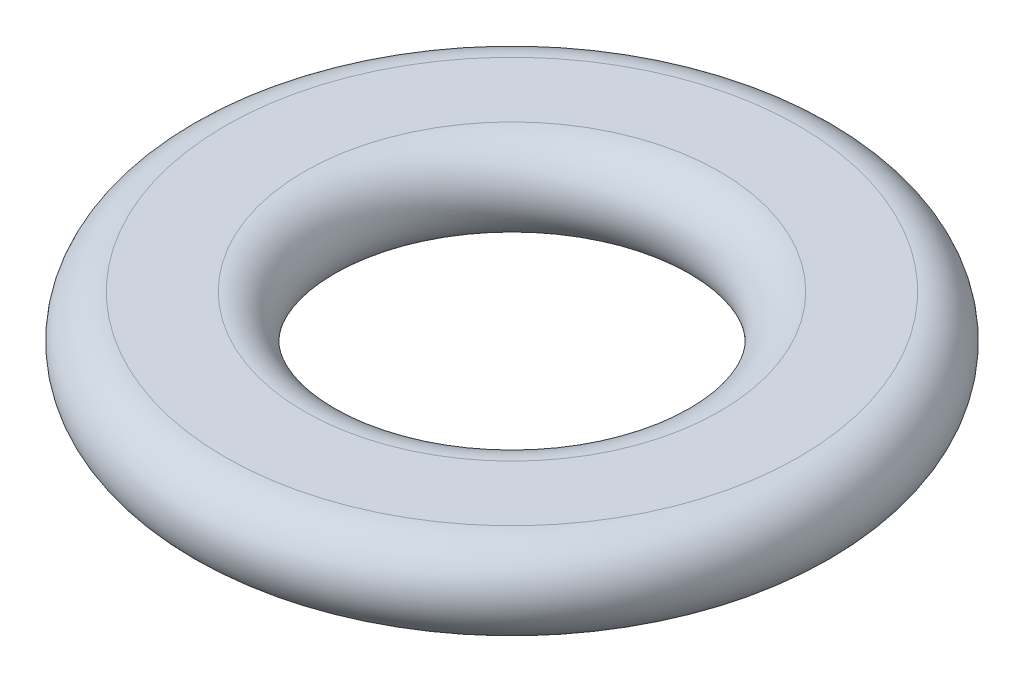
ISO-10303-21;
HEADER;
FILE_DESCRIPTION(('STEP AP214'),'2;1');
FILE_NAME('part.step','',(''),(''),'','','');
FILE_SCHEMA(('AUTOMOTIVE_DESIGN { 1 0 10303 214 1 1 1 1 }'));
ENDSEC;
DATA;
#1=APPLICATION_CONTEXT('core data for automotive mechanical design processes');
#2=APPLICATION_PROTOCOL_DEFINITION('international standard','automotive_design',2000,#1);
#3=PRODUCT_CONTEXT('',#1,'mechanical');
#4=PRODUCT('Part','Part','',(#3));
#5=PRODUCT_RELATED_PRODUCT_CATEGORY('part','',(#4));
#6=PRODUCT_DEFINITION_FORMATION('','',#4);
#7=PRODUCT_DEFINITION_CONTEXT('part definition',#1,'design');
#8=PRODUCT_DEFINITION('design','',#6,#7);
#9=PRODUCT_DEFINITION_SHAPE('','',#8);
#10=(LENGTH_UNIT() NAMED_UNIT(*) SI_UNIT(.MILLI.,.METRE.));
#11=(NAMED_UNIT(*) PLANE_ANGLE_UNIT() SI_UNIT($,.RADIAN.));
#12=(NAMED_UNIT(*) SI_UNIT($,.STERADIAN.) SOLID_ANGLE_UNIT());
#13=UNCERTAINTY_MEASURE_WITH_UNIT(LENGTH_MEASURE(1.E-05),#10,'distance_accuracy_value','');
#14=(GEOMETRIC_REPRESENTATION_CONTEXT(3) GLOBAL_UNCERTAINTY_ASSIGNED_CONTEXT((#13)) GLOBAL_UNIT_ASSIGNED_CONTEXT((#10,
#11,#12)) REPRESENTATION_CONTEXT('',''));
#15=CARTESIAN_POINT('',(0.,0.,0.));
#16=DIRECTION('',(0.,0.,1.));
#17=DIRECTION('',(1.,0.,0.));
#18=AXIS2_PLACEMENT_3D('',#15,#16,#17);
#19=CARTESIAN_POINT('',(0.,0.,0.));
#20=DIRECTION('',(0.,1.,0.));
#21=DIRECTION('',(0.,0.,1.));
#22=AXIS2_PLACEMENT_3D('',#19,#20,#21);
#23=TOROIDAL_SURFACE('',#22,3.15,0.65);
#24=CARTESIAN_POINT('',(0.,-0.65,0.));
#25=DIRECTION('',(0.,1.,0.));
#26=DIRECTION('',(0.,0.,1.));
#27=AXIS2_PLACEMENT_3D('',#24,#25,#26);
#28=CIRCLE('',#27,3.15);
#29=CARTESIAN_POINT('',(0.,-0.65,3.15));
#30=VERTEX_POINT('',#29);
#31=EDGE_CURVE('E10',#30,#30,#28,.T.);
#32=ORIENTED_EDGE('',*,*,#31,.F.);
#33=EDGE_LOOP('',(#32));
#34=FACE_BOUND('',#33,.T.);
#35=CARTESIAN_POINT('',(0.,0.65,0.));
#36=DIRECTION('',(0.,1.,0.));
#37=DIRECTION('',(0.,0.,1.));
#38=AXIS2_PLACEMENT_3D('',#35,#36,#37);
#39=CIRCLE('',#38,3.15);
#40=CARTESIAN_POINT('',(0.,0.65,3.15));
#41=VERTEX_POINT('',#40);
#42=EDGE_CURVE('E44',#41,#41,#39,.T.);
#43=ORIENTED_EDGE('',*,*,#42,.T.);
#44=EDGE_LOOP('',(#43));
#45=FACE_BOUND('',#44,.T.);
#46=ADVANCED_FACE('F30',(#34,#45),#23,.T.);
#47=CARTESIAN_POINT('',(3.15,-0.65,0.));
#48=DIRECTION('',(0.,1.,0.));
#49=DIRECTION('',(0.,0.,1.));
#50=AXIS2_PLACEMENT_3D('',#47,#48,#49);
#51=PLANE('',#50);
#52=CARTESIAN_POINT('',(0.,-0.65,0.));
#53=DIRECTION('',(0.,1.,0.));
#54=DIRECTION('',(0.,0.,1.));
#55=AXIS2_PLACEMENT_3D('',#52,#53,#54);
#56=CIRCLE('',#55,4.35);
#57=CARTESIAN_POINT('',(0.,-0.65,4.35));
#58=VERTEX_POINT('',#57);
#59=EDGE_CURVE('E36',#58,#58,#56,.T.);
#60=ORIENTED_EDGE('',*,*,#59,.F.);
#61=EDGE_LOOP('',(#60));
#62=FACE_BOUND('',#61,.T.);
#63=ORIENTED_EDGE('',*,*,#31,.T.);
#64=EDGE_LOOP('',(#63));
#65=FACE_BOUND('',#64,.T.);
#66=ADVANCED_FACE('F59',(#62,#65),#51,.F.);
#67=CARTESIAN_POINT('',(0.,0.,0.));
#68=DIRECTION('',(0.,1.,0.));
#69=DIRECTION('',(0.,0.,1.));
#70=AXIS2_PLACEMENT_3D('',#67,#68,#69);
#71=TOROIDAL_SURFACE('',#70,4.35,0.65);
#72=CARTESIAN_POINT('',(0.,0.65,0.));
#73=DIRECTION('',(0.,1.,0.));
#74=DIRECTION('',(0.,0.,1.));
#75=AXIS2_PLACEMENT_3D('',#72,#73,#74);
#76=CIRCLE('',#75,4.35);
#77=CARTESIAN_POINT('',(0.,0.65,4.35));
#78=VERTEX_POINT('',#77);
#79=EDGE_CURVE('E40',#78,#78,#76,.T.);
#80=ORIENTED_EDGE('',*,*,#79,.F.);
#81=EDGE_LOOP('',(#80));
#82=FACE_BOUND('',#81,.T.);
#83=ORIENTED_EDGE('',*,*,#59,.T.);
#84=EDGE_LOOP('',(#83));
#85=FACE_BOUND('',#84,.T.);
#86=ADVANCED_FACE('F54',(#82,#85),#71,.T.);
#87=CARTESIAN_POINT('',(3.15,0.65,0.));
#88=DIRECTION('',(0.,-1.,0.));
#89=DIRECTION('',(0.,0.,-1.));
#90=AXIS2_PLACEMENT_3D('',#87,#88,#89);
#91=PLANE('',#90);
#92=ORIENTED_EDGE('',*,*,#42,.F.);
#93=EDGE_LOOP('',(#92));
#94=FACE_BOUND('',#93,.T.);
#95=ORIENTED_EDGE('',*,*,#79,.T.);
#96=EDGE_LOOP('',(#95));
#97=FACE_BOUND('',#96,.T.);
#98=ADVANCED_FACE('F51',(#94,#97),#91,.F.);
#99=CLOSED_SHELL('',(#46,#66,#86,#98));
#100=MANIFOLD_SOLID_BREP('B2',#99);
#101=ADVANCED_BREP_SHAPE_REPRESENTATION('',(#18,#100),#14);
#102=SHAPE_DEFINITION_REPRESENTATION(#9,#101);
ENDSEC;
END-ISO-10303-21;
